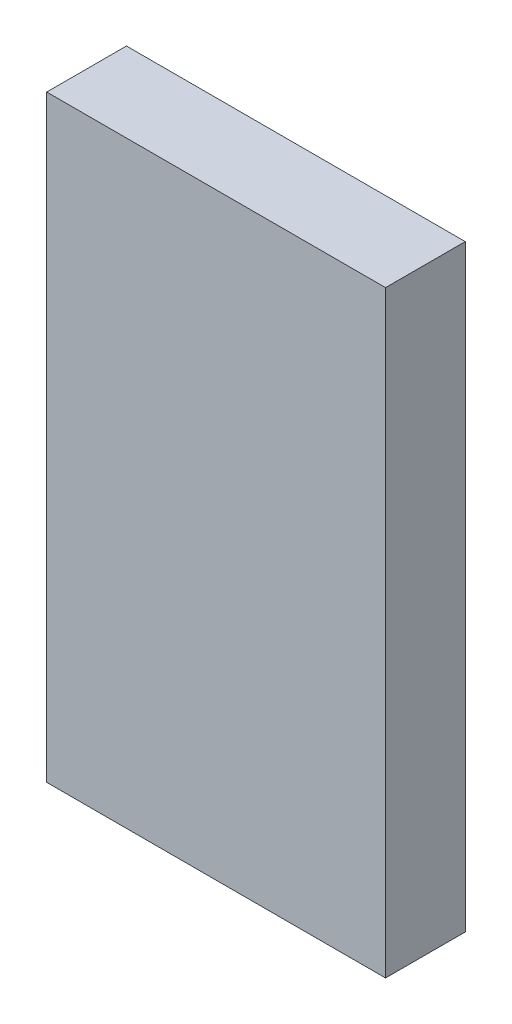
ISO-10303-21;
HEADER;
FILE_DESCRIPTION(('STEP AP214'),'2;1');
FILE_NAME('part.step','',(''),(''),'','','');
FILE_SCHEMA(('AUTOMOTIVE_DESIGN { 1 0 10303 214 1 1 1 1 }'));
ENDSEC;
DATA;
#1=APPLICATION_CONTEXT('core data for automotive mechanical design processes');
#2=APPLICATION_PROTOCOL_DEFINITION('international standard','automotive_design',2000,#1);
#3=PRODUCT_CONTEXT('',#1,'mechanical');
#4=PRODUCT('Part','Part','',(#3));
#5=PRODUCT_RELATED_PRODUCT_CATEGORY('part','',(#4));
#6=PRODUCT_DEFINITION_FORMATION('','',#4);
#7=PRODUCT_DEFINITION_CONTEXT('part definition',#1,'design');
#8=PRODUCT_DEFINITION('design','',#6,#7);
#9=PRODUCT_DEFINITION_SHAPE('','',#8);
#10=(LENGTH_UNIT() NAMED_UNIT(*) SI_UNIT(.MILLI.,.METRE.));
#11=(NAMED_UNIT(*) PLANE_ANGLE_UNIT() SI_UNIT($,.RADIAN.));
#12=(NAMED_UNIT(*) SI_UNIT($,.STERADIAN.) SOLID_ANGLE_UNIT());
#13=UNCERTAINTY_MEASURE_WITH_UNIT(LENGTH_MEASURE(1.E-05),#10,'distance_accuracy_value','');
#14=(GEOMETRIC_REPRESENTATION_CONTEXT(3) GLOBAL_UNCERTAINTY_ASSIGNED_CONTEXT((#13)) GLOBAL_UNIT_ASSIGNED_CONTEXT((#10,
#11,#12)) REPRESENTATION_CONTEXT('',''));
#15=CARTESIAN_POINT('',(0.,0.,0.));
#16=DIRECTION('',(0.,0.,1.));
#17=DIRECTION('',(1.,0.,0.));
#18=AXIS2_PLACEMENT_3D('',#15,#16,#17);
#19=CARTESIAN_POINT('',(-21.25,-37.5,10.));
#20=DIRECTION('',(1.,0.,0.));
#21=DIRECTION('',(0.,0.,-1.));
#22=AXIS2_PLACEMENT_3D('',#19,#20,#21);
#23=PLANE('',#22);
#24=DIRECTION('',(0.,-1.,0.));
#25=VECTOR('',#24,1.);
#26=CARTESIAN_POINT('',(-21.25,-37.5,0.));
#27=LINE('',#26,#25);
#28=CARTESIAN_POINT('',(-21.25,37.5,0.));
#29=VERTEX_POINT('',#28);
#30=CARTESIAN_POINT('',(-21.25,-37.5,0.));
#31=VERTEX_POINT('',#30);
#32=EDGE_CURVE('E96',#29,#31,#27,.T.);
#33=ORIENTED_EDGE('',*,*,#32,.T.);
#34=DIRECTION('',(0.,0.,-1.));
#35=VECTOR('',#34,1.);
#36=CARTESIAN_POINT('',(-21.25,-37.5,10.));
#37=LINE('',#36,#35);
#38=CARTESIAN_POINT('',(-21.25,-37.5,10.));
#39=VERTEX_POINT('',#38);
#40=EDGE_CURVE('E11',#39,#31,#37,.T.);
#41=ORIENTED_EDGE('',*,*,#40,.F.);
#42=DIRECTION('',(0.,-1.,0.));
#43=VECTOR('',#42,1.);
#44=CARTESIAN_POINT('',(-21.25,-37.5,10.));
#45=LINE('',#44,#43);
#46=CARTESIAN_POINT('',(-21.25,37.5,10.));
#47=VERTEX_POINT('',#46);
#48=EDGE_CURVE('E84',#47,#39,#45,.T.);
#49=ORIENTED_EDGE('',*,*,#48,.F.);
#50=DIRECTION('',(0.,0.,-1.));
#51=VECTOR('',#50,1.);
#52=CARTESIAN_POINT('',(-21.25,37.5,10.));
#53=LINE('',#52,#51);
#54=EDGE_CURVE('E92',#47,#29,#53,.T.);
#55=ORIENTED_EDGE('',*,*,#54,.T.);
#56=EDGE_LOOP('',(#33,#41,#49,#55));
#57=FACE_BOUND('',#56,.T.);
#58=ADVANCED_FACE('F33',(#57),#23,.F.);
#59=CARTESIAN_POINT('',(21.25,-37.5,10.));
#60=DIRECTION('',(0.,1.,0.));
#61=DIRECTION('',(0.,0.,1.));
#62=AXIS2_PLACEMENT_3D('',#59,#60,#61);
#63=PLANE('',#62);
#64=DIRECTION('',(1.,0.,0.));
#65=VECTOR('',#64,1.);
#66=CARTESIAN_POINT('',(21.25,-37.5,0.));
#67=LINE('',#66,#65);
#68=CARTESIAN_POINT('',(21.25,-37.5,0.));
#69=VERTEX_POINT('',#68);
#70=EDGE_CURVE('E88',#31,#69,#67,.T.);
#71=ORIENTED_EDGE('',*,*,#70,.T.);
#72=DIRECTION('',(0.,0.,-1.));
#73=VECTOR('',#72,1.);
#74=CARTESIAN_POINT('',(21.25,-37.5,10.));
#75=LINE('',#74,#73);
#76=CARTESIAN_POINT('',(21.25,-37.5,10.));
#77=VERTEX_POINT('',#76);
#78=EDGE_CURVE('E41',#77,#69,#75,.T.);
#79=ORIENTED_EDGE('',*,*,#78,.F.);
#80=DIRECTION('',(1.,0.,0.));
#81=VECTOR('',#80,1.);
#82=CARTESIAN_POINT('',(21.25,-37.5,10.));
#83=LINE('',#82,#81);
#84=EDGE_CURVE('E79',#39,#77,#83,.T.);
#85=ORIENTED_EDGE('',*,*,#84,.F.);
#86=ORIENTED_EDGE('',*,*,#40,.T.);
#87=EDGE_LOOP('',(#71,#79,#85,#86));
#88=FACE_BOUND('',#87,.T.);
#89=ADVANCED_FACE('F87',(#88),#63,.F.);
#90=CARTESIAN_POINT('',(21.25,-37.5,10.));
#91=DIRECTION('',(-1.,0.,0.));
#92=DIRECTION('',(0.,0.,1.));
#93=AXIS2_PLACEMENT_3D('',#90,#91,#92);
#94=PLANE('',#93);
#95=DIRECTION('',(0.,1.,0.));
#96=VECTOR('',#95,1.);
#97=CARTESIAN_POINT('',(21.25,-37.5,0.));
#98=LINE('',#97,#96);
#99=CARTESIAN_POINT('',(21.25,37.5,0.));
#100=VERTEX_POINT('',#99);
#101=EDGE_CURVE('E66',#69,#100,#98,.T.);
#102=ORIENTED_EDGE('',*,*,#101,.T.);
#103=DIRECTION('',(0.,0.,-1.));
#104=VECTOR('',#103,1.);
#105=CARTESIAN_POINT('',(21.25,37.5,10.));
#106=LINE('',#105,#104);
#107=CARTESIAN_POINT('',(21.25,37.5,10.));
#108=VERTEX_POINT('',#107);
#109=EDGE_CURVE('E89',#108,#100,#106,.T.);
#110=ORIENTED_EDGE('',*,*,#109,.F.);
#111=DIRECTION('',(0.,1.,0.));
#112=VECTOR('',#111,1.);
#113=CARTESIAN_POINT('',(21.25,-37.5,10.));
#114=LINE('',#113,#112);
#115=EDGE_CURVE('E82',#77,#108,#114,.T.);
#116=ORIENTED_EDGE('',*,*,#115,.F.);
#117=ORIENTED_EDGE('',*,*,#78,.T.);
#118=EDGE_LOOP('',(#102,#110,#116,#117));
#119=FACE_BOUND('',#118,.T.);
#120=ADVANCED_FACE('F90',(#119),#94,.F.);
#121=CARTESIAN_POINT('',(21.25,37.5,10.));
#122=DIRECTION('',(0.,-1.,0.));
#123=DIRECTION('',(0.,0.,-1.));
#124=AXIS2_PLACEMENT_3D('',#121,#122,#123);
#125=PLANE('',#124);
#126=DIRECTION('',(-1.,0.,0.));
#127=VECTOR('',#126,1.);
#128=CARTESIAN_POINT('',(21.25,37.5,0.));
#129=LINE('',#128,#127);
#130=EDGE_CURVE('E72',#100,#29,#129,.T.);
#131=ORIENTED_EDGE('',*,*,#130,.T.);
#132=ORIENTED_EDGE('',*,*,#54,.F.);
#133=DIRECTION('',(-1.,0.,0.));
#134=VECTOR('',#133,1.);
#135=CARTESIAN_POINT('',(21.25,37.5,10.));
#136=LINE('',#135,#134);
#137=EDGE_CURVE('E49',#108,#47,#136,.T.);
#138=ORIENTED_EDGE('',*,*,#137,.F.);
#139=ORIENTED_EDGE('',*,*,#109,.T.);
#140=EDGE_LOOP('',(#131,#132,#138,#139));
#141=FACE_BOUND('',#140,.T.);
#142=ADVANCED_FACE('F103',(#141),#125,.F.);
#143=CARTESIAN_POINT('',(0.,0.,10.));
#144=DIRECTION('',(0.,0.,1.));
#145=DIRECTION('',(1.,0.,0.));
#146=AXIS2_PLACEMENT_3D('',#143,#144,#145);
#147=PLANE('',#146);
#148=ORIENTED_EDGE('',*,*,#48,.T.);
#149=ORIENTED_EDGE('',*,*,#84,.T.);
#150=ORIENTED_EDGE('',*,*,#115,.T.);
#151=ORIENTED_EDGE('',*,*,#137,.T.);
#152=EDGE_LOOP('',(#148,#149,#150,#151));
#153=FACE_BOUND('',#152,.T.);
#154=ADVANCED_FACE('F80',(#153),#147,.T.);
#155=CARTESIAN_POINT('',(0.,0.,0.));
#156=DIRECTION('',(0.,0.,1.));
#157=DIRECTION('',(1.,0.,0.));
#158=AXIS2_PLACEMENT_3D('',#155,#156,#157);
#159=PLANE('',#158);
#160=ORIENTED_EDGE('',*,*,#32,.F.);
#161=ORIENTED_EDGE('',*,*,#130,.F.);
#162=ORIENTED_EDGE('',*,*,#101,.F.);
#163=ORIENTED_EDGE('',*,*,#70,.F.);
#164=EDGE_LOOP('',(#160,#161,#162,#163));
#165=FACE_BOUND('',#164,.T.);
#166=ADVANCED_FACE('F106',(#165),#159,.F.);
#167=CLOSED_SHELL('',(#58,#89,#120,#142,#154,#166));
#168=MANIFOLD_SOLID_BREP('B2',#167);
#169=ADVANCED_BREP_SHAPE_REPRESENTATION('',(#18,#168),#14);
#170=SHAPE_DEFINITION_REPRESENTATION(#9,#169);
ENDSEC;
END-ISO-10303-21;
